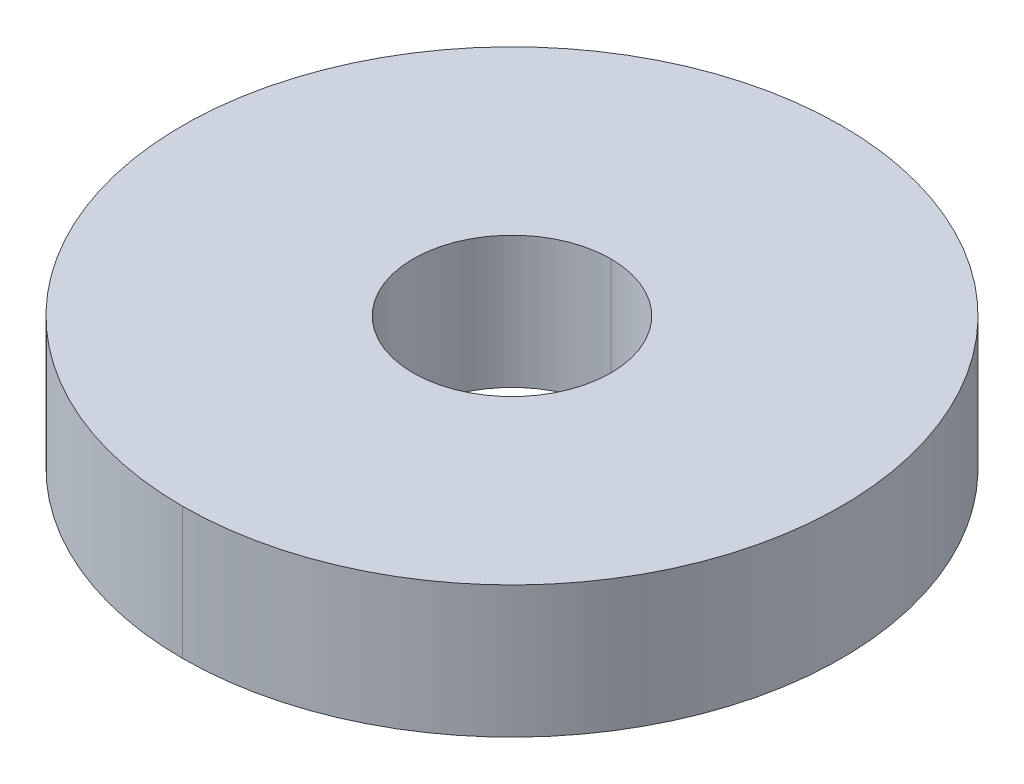
ISO-10303-21;
HEADER;
FILE_DESCRIPTION(('STEP AP214'),'2;1');
FILE_NAME('part.step','',(''),(''),'','','');
FILE_SCHEMA(('AUTOMOTIVE_DESIGN { 1 0 10303 214 1 1 1 1 }'));
ENDSEC;
DATA;
#1=APPLICATION_CONTEXT('core data for automotive mechanical design processes');
#2=APPLICATION_PROTOCOL_DEFINITION('international standard','automotive_design',2000,#1);
#3=PRODUCT_CONTEXT('',#1,'mechanical');
#4=PRODUCT('Part','Part','',(#3));
#5=PRODUCT_RELATED_PRODUCT_CATEGORY('part','',(#4));
#6=PRODUCT_DEFINITION_FORMATION('','',#4);
#7=PRODUCT_DEFINITION_CONTEXT('part definition',#1,'design');
#8=PRODUCT_DEFINITION('design','',#6,#7);
#9=PRODUCT_DEFINITION_SHAPE('','',#8);
#10=(LENGTH_UNIT() NAMED_UNIT(*) SI_UNIT(.MILLI.,.METRE.));
#11=(NAMED_UNIT(*) PLANE_ANGLE_UNIT() SI_UNIT($,.RADIAN.));
#12=(NAMED_UNIT(*) SI_UNIT($,.STERADIAN.) SOLID_ANGLE_UNIT());
#13=UNCERTAINTY_MEASURE_WITH_UNIT(LENGTH_MEASURE(1.E-05),#10,'distance_accuracy_value','');
#14=(GEOMETRIC_REPRESENTATION_CONTEXT(3) GLOBAL_UNCERTAINTY_ASSIGNED_CONTEXT((#13)) GLOBAL_UNIT_ASSIGNED_CONTEXT((#10,
#11,#12)) REPRESENTATION_CONTEXT('',''));
#15=CARTESIAN_POINT('',(0.,0.,0.));
#16=DIRECTION('',(0.,0.,1.));
#17=DIRECTION('',(1.,0.,0.));
#18=AXIS2_PLACEMENT_3D('',#15,#16,#17);
#19=CARTESIAN_POINT('',(0.,1.,0.));
#20=DIRECTION('',(0.,-1.,0.));
#21=DIRECTION('',(0.,0.,-1.));
#22=AXIS2_PLACEMENT_3D('',#19,#20,#21);
#23=CYLINDRICAL_SURFACE('',#22,0.75);
#24=DIRECTION('',(0.,-1.,0.));
#25=VECTOR('',#24,1.);
#26=CARTESIAN_POINT('',(0.,1.,0.75));
#27=LINE('',#26,#25);
#28=CARTESIAN_POINT('',(0.,1.,0.75));
#29=VERTEX_POINT('',#28);
#30=CARTESIAN_POINT('',(0.,0.,0.75));
#31=VERTEX_POINT('',#30);
#32=EDGE_CURVE('E77',#29,#31,#27,.T.);
#33=ORIENTED_EDGE('',*,*,#32,.F.);
#34=CARTESIAN_POINT('',(0.,1.,0.));
#35=DIRECTION('',(0.,1.,0.));
#36=DIRECTION('',(0.,0.,1.));
#37=AXIS2_PLACEMENT_3D('',#34,#35,#36);
#38=CIRCLE('',#37,0.75);
#39=CARTESIAN_POINT('',(0.,1.,-0.75));
#40=VERTEX_POINT('',#39);
#41=EDGE_CURVE('E20',#29,#40,#38,.T.);
#42=ORIENTED_EDGE('',*,*,#41,.T.);
#43=DIRECTION('',(0.,-1.,0.));
#44=VECTOR('',#43,1.);
#45=CARTESIAN_POINT('',(0.,1.,-0.75));
#46=LINE('',#45,#44);
#47=CARTESIAN_POINT('',(0.,0.,-0.75));
#48=VERTEX_POINT('',#47);
#49=EDGE_CURVE('E74',#40,#48,#46,.T.);
#50=ORIENTED_EDGE('',*,*,#49,.T.);
#51=CARTESIAN_POINT('',(0.,0.,0.));
#52=DIRECTION('',(0.,1.,0.));
#53=DIRECTION('',(0.,0.,1.));
#54=AXIS2_PLACEMENT_3D('',#51,#52,#53);
#55=CIRCLE('',#54,0.75);
#56=EDGE_CURVE('E11',#31,#48,#55,.T.);
#57=ORIENTED_EDGE('',*,*,#56,.F.);
#58=EDGE_LOOP('',(#33,#42,#50,#57));
#59=FACE_BOUND('',#58,.T.);
#60=ADVANCED_FACE('F17',(#59),#23,.F.);
#61=CARTESIAN_POINT('',(0.,1.,0.));
#62=DIRECTION('',(0.,-1.,0.));
#63=DIRECTION('',(0.,0.,-1.));
#64=AXIS2_PLACEMENT_3D('',#61,#62,#63);
#65=CYLINDRICAL_SURFACE('',#64,2.5);
#66=DIRECTION('',(0.,-1.,0.));
#67=VECTOR('',#66,1.);
#68=CARTESIAN_POINT('',(0.,1.,2.5));
#69=LINE('',#68,#67);
#70=CARTESIAN_POINT('',(0.,1.,2.5));
#71=VERTEX_POINT('',#70);
#72=CARTESIAN_POINT('',(0.,0.,2.5));
#73=VERTEX_POINT('',#72);
#74=EDGE_CURVE('E110',#71,#73,#69,.T.);
#75=ORIENTED_EDGE('',*,*,#74,.F.);
#76=CARTESIAN_POINT('',(0.,1.,0.));
#77=DIRECTION('',(0.,1.,0.));
#78=DIRECTION('',(0.,0.,1.));
#79=AXIS2_PLACEMENT_3D('',#76,#77,#78);
#80=CIRCLE('',#79,2.5);
#81=CARTESIAN_POINT('',(0.,1.,-2.5));
#82=VERTEX_POINT('',#81);
#83=EDGE_CURVE('E82',#82,#71,#80,.T.);
#84=ORIENTED_EDGE('',*,*,#83,.F.);
#85=DIRECTION('',(0.,-1.,0.));
#86=VECTOR('',#85,1.);
#87=CARTESIAN_POINT('',(0.,1.,-2.5));
#88=LINE('',#87,#86);
#89=CARTESIAN_POINT('',(0.,0.,-2.5));
#90=VERTEX_POINT('',#89);
#91=EDGE_CURVE('E109',#82,#90,#88,.T.);
#92=ORIENTED_EDGE('',*,*,#91,.T.);
#93=CARTESIAN_POINT('',(0.,0.,0.));
#94=DIRECTION('',(0.,1.,0.));
#95=DIRECTION('',(0.,0.,1.));
#96=AXIS2_PLACEMENT_3D('',#93,#94,#95);
#97=CIRCLE('',#96,2.5);
#98=EDGE_CURVE('E26',#90,#73,#97,.T.);
#99=ORIENTED_EDGE('',*,*,#98,.T.);
#100=EDGE_LOOP('',(#75,#84,#92,#99));
#101=FACE_BOUND('',#100,.T.);
#102=ADVANCED_FACE('F123',(#101),#65,.T.);
#103=CARTESIAN_POINT('',(0.,0.,0.));
#104=DIRECTION('',(0.,1.,0.));
#105=DIRECTION('',(1.,0.,0.));
#106=AXIS2_PLACEMENT_3D('',#103,#104,#105);
#107=PLANE('',#106);
#108=CARTESIAN_POINT('',(0.,0.,0.));
#109=DIRECTION('',(0.,1.,0.));
#110=DIRECTION('',(0.,0.,1.));
#111=AXIS2_PLACEMENT_3D('',#108,#109,#110);
#112=CIRCLE('',#111,0.75);
#113=EDGE_CURVE('E87',#48,#31,#112,.T.);
#114=ORIENTED_EDGE('',*,*,#113,.T.);
#115=ORIENTED_EDGE('',*,*,#56,.T.);
#116=EDGE_LOOP('',(#114,#115));
#117=FACE_BOUND('',#116,.T.);
#118=ORIENTED_EDGE('',*,*,#98,.F.);
#119=CARTESIAN_POINT('',(0.,0.,0.));
#120=DIRECTION('',(0.,1.,0.));
#121=DIRECTION('',(0.,0.,1.));
#122=AXIS2_PLACEMENT_3D('',#119,#120,#121);
#123=CIRCLE('',#122,2.5);
#124=EDGE_CURVE('E105',#73,#90,#123,.T.);
#125=ORIENTED_EDGE('',*,*,#124,.F.);
#126=EDGE_LOOP('',(#118,#125));
#127=FACE_BOUND('',#126,.T.);
#128=ADVANCED_FACE('F126',(#117,#127),#107,.F.);
#129=CARTESIAN_POINT('',(0.,1.,0.));
#130=DIRECTION('',(0.,1.,0.));
#131=DIRECTION('',(1.,0.,0.));
#132=AXIS2_PLACEMENT_3D('',#129,#130,#131);
#133=PLANE('',#132);
#134=CARTESIAN_POINT('',(0.,1.,0.));
#135=DIRECTION('',(0.,1.,0.));
#136=DIRECTION('',(0.,0.,1.));
#137=AXIS2_PLACEMENT_3D('',#134,#135,#136);
#138=CIRCLE('',#137,0.75);
#139=EDGE_CURVE('E85',#40,#29,#138,.T.);
#140=ORIENTED_EDGE('',*,*,#139,.F.);
#141=ORIENTED_EDGE('',*,*,#41,.F.);
#142=EDGE_LOOP('',(#140,#141));
#143=FACE_BOUND('',#142,.T.);
#144=ORIENTED_EDGE('',*,*,#83,.T.);
#145=CARTESIAN_POINT('',(0.,1.,0.));
#146=DIRECTION('',(0.,1.,0.));
#147=DIRECTION('',(0.,0.,1.));
#148=AXIS2_PLACEMENT_3D('',#145,#146,#147);
#149=CIRCLE('',#148,2.5);
#150=EDGE_CURVE('E89',#71,#82,#149,.T.);
#151=ORIENTED_EDGE('',*,*,#150,.T.);
#152=EDGE_LOOP('',(#144,#151));
#153=FACE_BOUND('',#152,.T.);
#154=ADVANCED_FACE('F91',(#143,#153),#133,.T.);
#155=CARTESIAN_POINT('',(0.,1.,0.));
#156=DIRECTION('',(0.,-1.,0.));
#157=DIRECTION('',(0.,0.,-1.));
#158=AXIS2_PLACEMENT_3D('',#155,#156,#157);
#159=CYLINDRICAL_SURFACE('',#158,2.5);
#160=ORIENTED_EDGE('',*,*,#150,.F.);
#161=ORIENTED_EDGE('',*,*,#74,.T.);
#162=ORIENTED_EDGE('',*,*,#124,.T.);
#163=ORIENTED_EDGE('',*,*,#91,.F.);
#164=EDGE_LOOP('',(#160,#161,#162,#163));
#165=FACE_BOUND('',#164,.T.);
#166=ADVANCED_FACE('F125',(#165),#159,.T.);
#167=CARTESIAN_POINT('',(0.,1.,0.));
#168=DIRECTION('',(0.,-1.,0.));
#169=DIRECTION('',(0.,0.,-1.));
#170=AXIS2_PLACEMENT_3D('',#167,#168,#169);
#171=CYLINDRICAL_SURFACE('',#170,0.75);
#172=ORIENTED_EDGE('',*,*,#139,.T.);
#173=ORIENTED_EDGE('',*,*,#32,.T.);
#174=ORIENTED_EDGE('',*,*,#113,.F.);
#175=ORIENTED_EDGE('',*,*,#49,.F.);
#176=EDGE_LOOP('',(#172,#173,#174,#175));
#177=FACE_BOUND('',#176,.T.);
#178=ADVANCED_FACE('F84',(#177),#171,.F.);
#179=CLOSED_SHELL('',(#60,#102,#128,#154,#166,#178));
#180=MANIFOLD_SOLID_BREP('B1',#179);
#181=ADVANCED_BREP_SHAPE_REPRESENTATION('',(#18,#180),#14);
#182=SHAPE_DEFINITION_REPRESENTATION(#9,#181);
ENDSEC;
END-ISO-10303-21;
